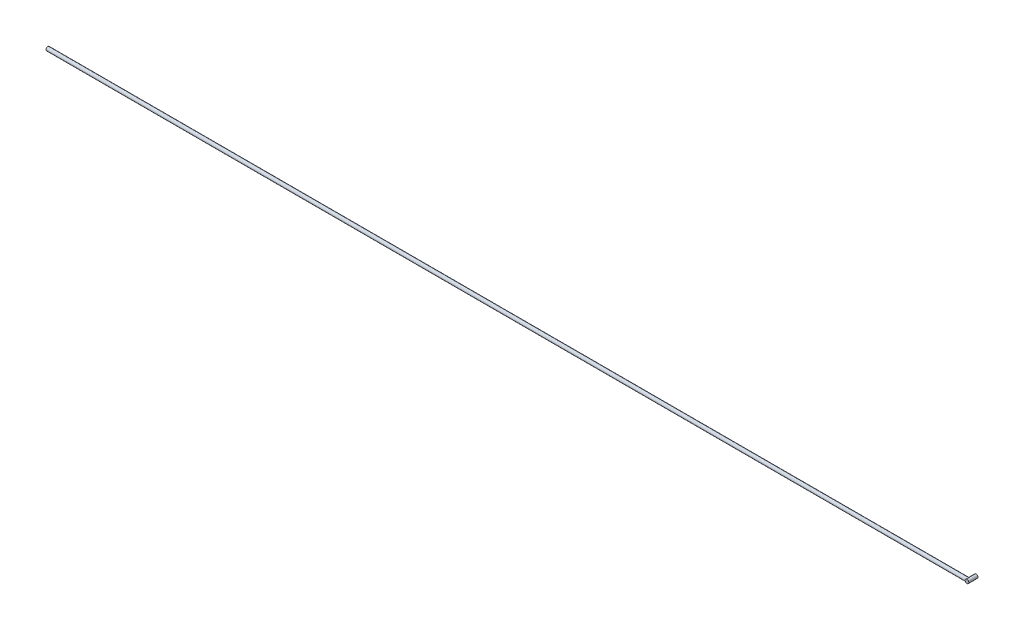
ISO-10303-21;
HEADER;
FILE_DESCRIPTION(('STEP AP214'),'2;1');
FILE_NAME('part.step','',(''),(''),'','','');
FILE_SCHEMA(('AUTOMOTIVE_DESIGN { 1 0 10303 214 1 1 1 1 }'));
ENDSEC;
DATA;
#1=APPLICATION_CONTEXT('core data for automotive mechanical design processes');
#2=APPLICATION_PROTOCOL_DEFINITION('international standard','automotive_design',2000,#1);
#3=PRODUCT_CONTEXT('',#1,'mechanical');
#4=PRODUCT('Part','Part','',(#3));
#5=PRODUCT_RELATED_PRODUCT_CATEGORY('part','',(#4));
#6=PRODUCT_DEFINITION_FORMATION('','',#4);
#7=PRODUCT_DEFINITION_CONTEXT('part definition',#1,'design');
#8=PRODUCT_DEFINITION('design','',#6,#7);
#9=PRODUCT_DEFINITION_SHAPE('','',#8);
#10=(LENGTH_UNIT() NAMED_UNIT(*) SI_UNIT(.MILLI.,.METRE.));
#11=(NAMED_UNIT(*) PLANE_ANGLE_UNIT() SI_UNIT($,.RADIAN.));
#12=(NAMED_UNIT(*) SI_UNIT($,.STERADIAN.) SOLID_ANGLE_UNIT());
#13=UNCERTAINTY_MEASURE_WITH_UNIT(LENGTH_MEASURE(1.E-05),#10,'distance_accuracy_value','');
#14=(GEOMETRIC_REPRESENTATION_CONTEXT(3) GLOBAL_UNCERTAINTY_ASSIGNED_CONTEXT((#13)) GLOBAL_UNIT_ASSIGNED_CONTEXT((#10,
#11,#12)) REPRESENTATION_CONTEXT('',''));
#15=CARTESIAN_POINT('',(0.,0.,0.));
#16=DIRECTION('',(0.,0.,1.));
#17=DIRECTION('',(1.,0.,0.));
#18=AXIS2_PLACEMENT_3D('',#15,#16,#17);
#19=CARTESIAN_POINT('',(-250.,0.,0.));
#20=DIRECTION('',(1.,0.,0.));
#21=DIRECTION('',(0.,0.,-1.));
#22=AXIS2_PLACEMENT_3D('',#19,#20,#21);
#23=PLANE('',#22);
#24=CARTESIAN_POINT('',(-250.,0.,0.));
#25=DIRECTION('',(1.,0.,0.));
#26=DIRECTION('',(0.,0.,-1.));
#27=AXIS2_PLACEMENT_3D('',#24,#25,#26);
#28=CIRCLE('',#27,1.);
#29=CARTESIAN_POINT('',(-250.,0.,-1.));
#30=VERTEX_POINT('',#29);
#31=EDGE_CURVE('E79',#30,#30,#28,.T.);
#32=ORIENTED_EDGE('',*,*,#31,.F.);
#33=EDGE_LOOP('',(#32));
#34=FACE_BOUND('',#33,.T.);
#35=ADVANCED_FACE('F51',(#34),#23,.F.);
#36=CARTESIAN_POINT('',(-250.,0.,0.));
#37=DIRECTION('',(1.,0.,0.));
#38=DIRECTION('',(0.,0.,-1.));
#39=AXIS2_PLACEMENT_3D('',#36,#37,#38);
#40=CYLINDRICAL_SURFACE('',#39,1.);
#41=CARTESIAN_POINT('',(250.,0.,0.));
#42=DIRECTION('',(0.707106781186547,0.,-0.707106781186547));
#43=DIRECTION('',(0.707106781186547,0.,0.707106781186547));
#44=AXIS2_PLACEMENT_3D('',#41,#42,#43);
#45=ELLIPSE('',#44,1.4142135623731,1.);
#46=CARTESIAN_POINT('',(250.,-1.,0.));
#47=VERTEX_POINT('',#46);
#48=CARTESIAN_POINT('',(250.,1.,0.));
#49=VERTEX_POINT('',#48);
#50=EDGE_CURVE('E12',#47,#49,#45,.T.);
#51=ORIENTED_EDGE('',*,*,#50,.F.);
#52=CARTESIAN_POINT('',(250.,0.,0.));
#53=DIRECTION('',(0.707106781186547,0.,0.707106781186547));
#54=DIRECTION('',(0.707106781186547,0.,-0.707106781186547));
#55=AXIS2_PLACEMENT_3D('',#52,#53,#54);
#56=ELLIPSE('',#55,1.4142135623731,1.);
#57=CARTESIAN_POINT('',(249.,0.,1.));
#58=VERTEX_POINT('',#57);
#59=EDGE_CURVE('E66',#58,#47,#56,.T.);
#60=ORIENTED_EDGE('',*,*,#59,.F.);
#61=EDGE_CURVE('E59',#49,#58,#56,.T.);
#62=ORIENTED_EDGE('',*,*,#61,.F.);
#63=EDGE_LOOP('',(#51,#60,#62));
#64=FACE_BOUND('',#63,.T.);
#65=ORIENTED_EDGE('',*,*,#31,.T.);
#66=EDGE_LOOP('',(#65));
#67=FACE_BOUND('',#66,.T.);
#68=ADVANCED_FACE('F70',(#64,#67),#40,.T.);
#69=CARTESIAN_POINT('',(250.,0.,1.));
#70=DIRECTION('',(0.,0.,-1.));
#71=DIRECTION('',(-1.,0.,0.));
#72=AXIS2_PLACEMENT_3D('',#69,#70,#71);
#73=PLANE('',#72);
#74=CARTESIAN_POINT('',(250.,0.,1.));
#75=DIRECTION('',(0.,0.,-1.));
#76=DIRECTION('',(-1.,0.,0.));
#77=AXIS2_PLACEMENT_3D('',#74,#75,#76);
#78=CIRCLE('',#77,1.);
#79=EDGE_CURVE('E77',#58,#58,#78,.T.);
#80=ORIENTED_EDGE('',*,*,#79,.F.);
#81=EDGE_LOOP('',(#80));
#82=FACE_BOUND('',#81,.T.);
#83=ADVANCED_FACE('F98',(#82),#73,.F.);
#84=CARTESIAN_POINT('',(250.,0.,-4.));
#85=DIRECTION('',(0.,0.,-1.));
#86=DIRECTION('',(-1.,0.,0.));
#87=AXIS2_PLACEMENT_3D('',#84,#85,#86);
#88=PLANE('',#87);
#89=CARTESIAN_POINT('',(250.,0.,-4.));
#90=DIRECTION('',(0.,0.,-1.));
#91=DIRECTION('',(-1.,0.,0.));
#92=AXIS2_PLACEMENT_3D('',#89,#90,#91);
#93=CIRCLE('',#92,1.);
#94=CARTESIAN_POINT('',(249.,0.,-4.));
#95=VERTEX_POINT('',#94);
#96=EDGE_CURVE('E83',#95,#95,#93,.T.);
#97=ORIENTED_EDGE('',*,*,#96,.T.);
#98=EDGE_LOOP('',(#97));
#99=FACE_BOUND('',#98,.T.);
#100=ADVANCED_FACE('F92',(#99),#88,.T.);
#101=CARTESIAN_POINT('',(250.,0.,1.));
#102=DIRECTION('',(0.,0.,-1.));
#103=DIRECTION('',(-1.,0.,0.));
#104=AXIS2_PLACEMENT_3D('',#101,#102,#103);
#105=CYLINDRICAL_SURFACE('',#104,1.);
#106=ORIENTED_EDGE('',*,*,#59,.T.);
#107=ORIENTED_EDGE('',*,*,#50,.T.);
#108=ORIENTED_EDGE('',*,*,#61,.T.);
#109=ORIENTED_EDGE('',*,*,#79,.T.);
#110=EDGE_LOOP('',(#106,#107,#108,#109));
#111=FACE_BOUND('',#110,.T.);
#112=ORIENTED_EDGE('',*,*,#96,.F.);
#113=EDGE_LOOP('',(#112));
#114=FACE_BOUND('',#113,.T.);
#115=ADVANCED_FACE('F74',(#111,#114),#105,.T.);
#116=CLOSED_SHELL('',(#35,#68,#83,#100,#115));
#117=MANIFOLD_SOLID_BREP('B2',#116);
#118=ADVANCED_BREP_SHAPE_REPRESENTATION('',(#18,#117),#14);
#119=SHAPE_DEFINITION_REPRESENTATION(#9,#118);
ENDSEC;
END-ISO-10303-21;
